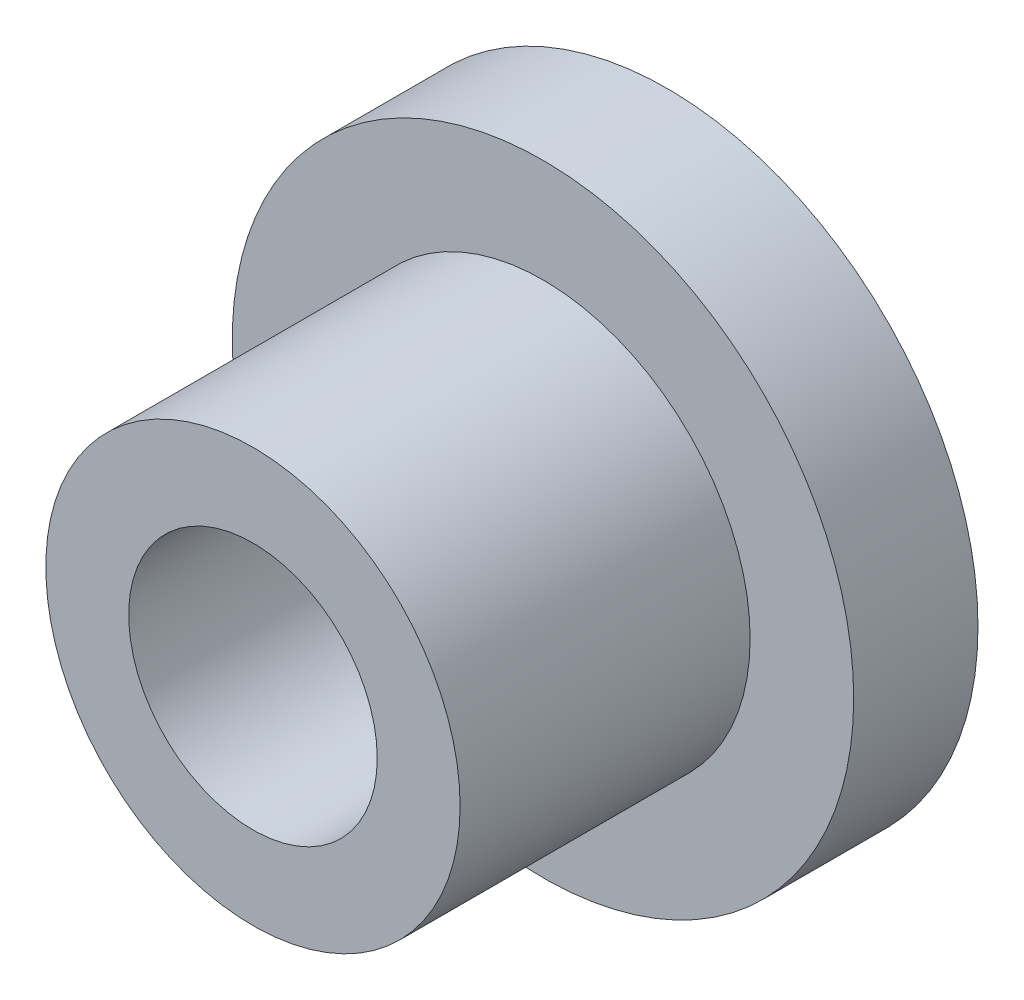
ISO-10303-21;
HEADER;
FILE_DESCRIPTION(('STEP AP214'),'2;1');
FILE_NAME('part.step','',(''),(''),'','','');
FILE_SCHEMA(('AUTOMOTIVE_DESIGN { 1 0 10303 214 1 1 1 1 }'));
ENDSEC;
DATA;
#1=APPLICATION_CONTEXT('core data for automotive mechanical design processes');
#2=APPLICATION_PROTOCOL_DEFINITION('international standard','automotive_design',2000,#1);
#3=PRODUCT_CONTEXT('',#1,'mechanical');
#4=PRODUCT('Part','Part','',(#3));
#5=PRODUCT_RELATED_PRODUCT_CATEGORY('part','',(#4));
#6=PRODUCT_DEFINITION_FORMATION('','',#4);
#7=PRODUCT_DEFINITION_CONTEXT('part definition',#1,'design');
#8=PRODUCT_DEFINITION('design','',#6,#7);
#9=PRODUCT_DEFINITION_SHAPE('','',#8);
#10=(LENGTH_UNIT() NAMED_UNIT(*) SI_UNIT(.MILLI.,.METRE.));
#11=(NAMED_UNIT(*) PLANE_ANGLE_UNIT() SI_UNIT($,.RADIAN.));
#12=(NAMED_UNIT(*) SI_UNIT($,.STERADIAN.) SOLID_ANGLE_UNIT());
#13=UNCERTAINTY_MEASURE_WITH_UNIT(LENGTH_MEASURE(1.E-05),#10,'distance_accuracy_value','');
#14=(GEOMETRIC_REPRESENTATION_CONTEXT(3) GLOBAL_UNCERTAINTY_ASSIGNED_CONTEXT((#13)) GLOBAL_UNIT_ASSIGNED_CONTEXT((#10,
#11,#12)) REPRESENTATION_CONTEXT('',''));
#15=CARTESIAN_POINT('',(0.,0.,0.));
#16=DIRECTION('',(0.,0.,1.));
#17=DIRECTION('',(1.,0.,0.));
#18=AXIS2_PLACEMENT_3D('',#15,#16,#17);
#19=CARTESIAN_POINT('',(0.,10.,14.3259557344064));
#20=DIRECTION('',(0.,0.,-1.));
#21=DIRECTION('',(-1.,0.,0.));
#22=AXIS2_PLACEMENT_3D('',#19,#20,#21);
#23=PLANE('',#22);
#24=CARTESIAN_POINT('',(0.,0.,14.3259557344064));
#25=DIRECTION('',(0.,0.,1.));
#26=DIRECTION('',(1.,0.,0.));
#27=AXIS2_PLACEMENT_3D('',#24,#25,#26);
#28=CIRCLE('',#27,6.);
#29=CARTESIAN_POINT('',(6.,0.,14.3259557344064));
#30=VERTEX_POINT('',#29);
#31=EDGE_CURVE('E10',#30,#30,#28,.T.);
#32=ORIENTED_EDGE('',*,*,#31,.F.);
#33=EDGE_LOOP('',(#32));
#34=FACE_BOUND('',#33,.T.);
#35=CARTESIAN_POINT('',(0.,0.,14.3259557344064));
#36=DIRECTION('',(0.,0.,1.));
#37=DIRECTION('',(1.,0.,0.));
#38=AXIS2_PLACEMENT_3D('',#35,#36,#37);
#39=CIRCLE('',#38,10.);
#40=CARTESIAN_POINT('',(10.,0.,14.3259557344064));
#41=VERTEX_POINT('',#40);
#42=EDGE_CURVE('E59',#41,#41,#39,.T.);
#43=ORIENTED_EDGE('',*,*,#42,.T.);
#44=EDGE_LOOP('',(#43));
#45=FACE_BOUND('',#44,.T.);
#46=ADVANCED_FACE('F37',(#34,#45),#23,.F.);
#47=CARTESIAN_POINT('',(0.,0.,17.5855130784708));
#48=DIRECTION('',(0.,0.,1.));
#49=DIRECTION('',(1.,0.,0.));
#50=AXIS2_PLACEMENT_3D('',#47,#48,#49);
#51=CYLINDRICAL_SURFACE('',#50,6.);
#52=CARTESIAN_POINT('',(0.,0.,-5.67404426559356));
#53=DIRECTION('',(0.,0.,1.));
#54=DIRECTION('',(1.,0.,0.));
#55=AXIS2_PLACEMENT_3D('',#52,#53,#54);
#56=CIRCLE('',#55,6.);
#57=CARTESIAN_POINT('',(6.,0.,-5.67404426559356));
#58=VERTEX_POINT('',#57);
#59=EDGE_CURVE('E43',#58,#58,#56,.T.);
#60=ORIENTED_EDGE('',*,*,#59,.F.);
#61=EDGE_LOOP('',(#60));
#62=FACE_BOUND('',#61,.T.);
#63=ORIENTED_EDGE('',*,*,#31,.T.);
#64=EDGE_LOOP('',(#63));
#65=FACE_BOUND('',#64,.T.);
#66=ADVANCED_FACE('F84',(#62,#65),#51,.F.);
#67=CARTESIAN_POINT('',(0.,6.,-5.67404426559356));
#68=DIRECTION('',(0.,0.,1.));
#69=DIRECTION('',(1.,0.,0.));
#70=AXIS2_PLACEMENT_3D('',#67,#68,#69);
#71=PLANE('',#70);
#72=CARTESIAN_POINT('',(0.,0.,-5.67404426559356));
#73=DIRECTION('',(0.,0.,1.));
#74=DIRECTION('',(1.,0.,0.));
#75=AXIS2_PLACEMENT_3D('',#72,#73,#74);
#76=CIRCLE('',#75,15.);
#77=CARTESIAN_POINT('',(15.,0.,-5.67404426559356));
#78=VERTEX_POINT('',#77);
#79=EDGE_CURVE('E47',#78,#78,#76,.T.);
#80=ORIENTED_EDGE('',*,*,#79,.F.);
#81=EDGE_LOOP('',(#80));
#82=FACE_BOUND('',#81,.T.);
#83=ORIENTED_EDGE('',*,*,#59,.T.);
#84=EDGE_LOOP('',(#83));
#85=FACE_BOUND('',#84,.T.);
#86=ADVANCED_FACE('F79',(#82,#85),#71,.F.);
#87=CARTESIAN_POINT('',(0.,0.,17.5855130784708));
#88=DIRECTION('',(0.,0.,1.));
#89=DIRECTION('',(1.,0.,0.));
#90=AXIS2_PLACEMENT_3D('',#87,#88,#89);
#91=CYLINDRICAL_SURFACE('',#90,15.);
#92=CARTESIAN_POINT('',(0.,0.,0.325955734406441));
#93=DIRECTION('',(0.,0.,1.));
#94=DIRECTION('',(1.,0.,0.));
#95=AXIS2_PLACEMENT_3D('',#92,#93,#94);
#96=CIRCLE('',#95,15.);
#97=CARTESIAN_POINT('',(15.,0.,0.325955734406441));
#98=VERTEX_POINT('',#97);
#99=EDGE_CURVE('E51',#98,#98,#96,.T.);
#100=ORIENTED_EDGE('',*,*,#99,.F.);
#101=EDGE_LOOP('',(#100));
#102=FACE_BOUND('',#101,.T.);
#103=ORIENTED_EDGE('',*,*,#79,.T.);
#104=EDGE_LOOP('',(#103));
#105=FACE_BOUND('',#104,.T.);
#106=ADVANCED_FACE('F73',(#102,#105),#91,.T.);
#107=CARTESIAN_POINT('',(0.,10.,0.325955734406439));
#108=DIRECTION('',(0.,0.,-1.));
#109=DIRECTION('',(-1.,0.,0.));
#110=AXIS2_PLACEMENT_3D('',#107,#108,#109);
#111=PLANE('',#110);
#112=CARTESIAN_POINT('',(0.,0.,0.325955734406438));
#113=DIRECTION('',(0.,0.,1.));
#114=DIRECTION('',(1.,0.,0.));
#115=AXIS2_PLACEMENT_3D('',#112,#113,#114);
#116=CIRCLE('',#115,10.);
#117=CARTESIAN_POINT('',(10.,0.,0.325955734406438));
#118=VERTEX_POINT('',#117);
#119=EDGE_CURVE('E56',#118,#118,#116,.T.);
#120=ORIENTED_EDGE('',*,*,#119,.F.);
#121=EDGE_LOOP('',(#120));
#122=FACE_BOUND('',#121,.T.);
#123=ORIENTED_EDGE('',*,*,#99,.T.);
#124=EDGE_LOOP('',(#123));
#125=FACE_BOUND('',#124,.T.);
#126=ADVANCED_FACE('F67',(#122,#125),#111,.F.);
#127=CARTESIAN_POINT('',(0.,0.,17.5855130784708));
#128=DIRECTION('',(0.,0.,1.));
#129=DIRECTION('',(1.,0.,0.));
#130=AXIS2_PLACEMENT_3D('',#127,#128,#129);
#131=CYLINDRICAL_SURFACE('',#130,10.);
#132=ORIENTED_EDGE('',*,*,#42,.F.);
#133=EDGE_LOOP('',(#132));
#134=FACE_BOUND('',#133,.T.);
#135=ORIENTED_EDGE('',*,*,#119,.T.);
#136=EDGE_LOOP('',(#135));
#137=FACE_BOUND('',#136,.T.);
#138=ADVANCED_FACE('F64',(#134,#137),#131,.T.);
#139=CLOSED_SHELL('',(#46,#66,#86,#106,#126,#138));
#140=MANIFOLD_SOLID_BREP('B2',#139);
#141=ADVANCED_BREP_SHAPE_REPRESENTATION('',(#18,#140),#14);
#142=SHAPE_DEFINITION_REPRESENTATION(#9,#141);
ENDSEC;
END-ISO-10303-21;
